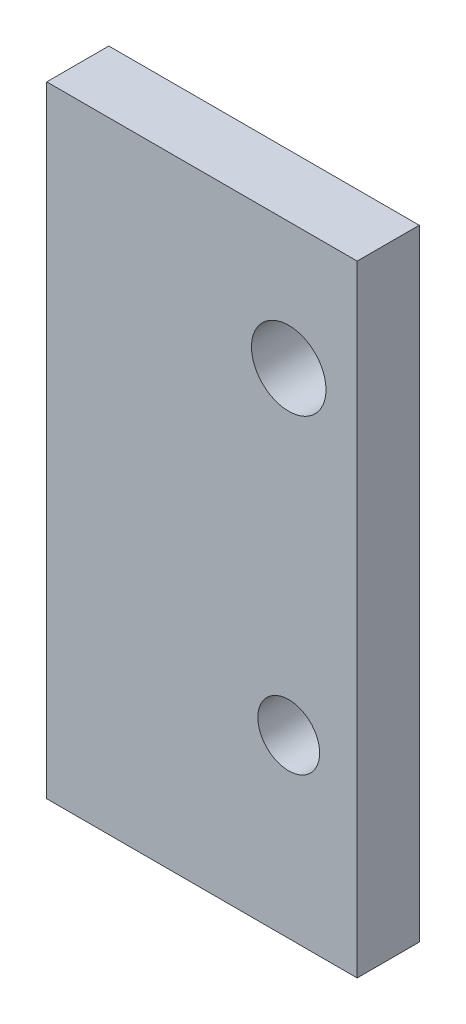
ISO-10303-21;
HEADER;
FILE_DESCRIPTION(('STEP AP214'),'2;1');
FILE_NAME('part.step','',(''),(''),'','','');
FILE_SCHEMA(('AUTOMOTIVE_DESIGN { 1 0 10303 214 1 1 1 1 }'));
ENDSEC;
DATA;
#1=APPLICATION_CONTEXT('core data for automotive mechanical design processes');
#2=APPLICATION_PROTOCOL_DEFINITION('international standard','automotive_design',2000,#1);
#3=PRODUCT_CONTEXT('',#1,'mechanical');
#4=PRODUCT('Part','Part','',(#3));
#5=PRODUCT_RELATED_PRODUCT_CATEGORY('part','',(#4));
#6=PRODUCT_DEFINITION_FORMATION('','',#4);
#7=PRODUCT_DEFINITION_CONTEXT('part definition',#1,'design');
#8=PRODUCT_DEFINITION('design','',#6,#7);
#9=PRODUCT_DEFINITION_SHAPE('','',#8);
#10=(LENGTH_UNIT() NAMED_UNIT(*) SI_UNIT(.MILLI.,.METRE.));
#11=(NAMED_UNIT(*) PLANE_ANGLE_UNIT() SI_UNIT($,.RADIAN.));
#12=(NAMED_UNIT(*) SI_UNIT($,.STERADIAN.) SOLID_ANGLE_UNIT());
#13=UNCERTAINTY_MEASURE_WITH_UNIT(LENGTH_MEASURE(1.E-05),#10,'distance_accuracy_value','');
#14=(GEOMETRIC_REPRESENTATION_CONTEXT(3) GLOBAL_UNCERTAINTY_ASSIGNED_CONTEXT((#13)) GLOBAL_UNIT_ASSIGNED_CONTEXT((#10,
#11,#12)) REPRESENTATION_CONTEXT('',''));
#15=CARTESIAN_POINT('',(0.,0.,0.));
#16=DIRECTION('',(0.,0.,1.));
#17=DIRECTION('',(1.,0.,0.));
#18=AXIS2_PLACEMENT_3D('',#15,#16,#17);
#19=CARTESIAN_POINT('',(6.35,12.7,2.54));
#20=DIRECTION('',(-1.,0.,0.));
#21=DIRECTION('',(0.,-1.,0.));
#22=AXIS2_PLACEMENT_3D('',#19,#20,#21);
#23=PLANE('',#22);
#24=DIRECTION('',(0.,1.,0.));
#25=VECTOR('',#24,1.);
#26=CARTESIAN_POINT('',(6.35,12.7,0.));
#27=LINE('',#26,#25);
#28=CARTESIAN_POINT('',(6.35,-12.7,0.));
#29=VERTEX_POINT('',#28);
#30=CARTESIAN_POINT('',(6.35,12.7,0.));
#31=VERTEX_POINT('',#30);
#32=EDGE_CURVE('E96',#29,#31,#27,.T.);
#33=ORIENTED_EDGE('',*,*,#32,.T.);
#34=DIRECTION('',(0.,0.,-1.));
#35=VECTOR('',#34,1.);
#36=CARTESIAN_POINT('',(6.35,12.7,2.54));
#37=LINE('',#36,#35);
#38=CARTESIAN_POINT('',(6.35,12.7,2.54));
#39=VERTEX_POINT('',#38);
#40=EDGE_CURVE('E11',#39,#31,#37,.T.);
#41=ORIENTED_EDGE('',*,*,#40,.F.);
#42=DIRECTION('',(0.,1.,0.));
#43=VECTOR('',#42,1.);
#44=CARTESIAN_POINT('',(6.35,12.7,2.54));
#45=LINE('',#44,#43);
#46=CARTESIAN_POINT('',(6.35,-12.7,2.54));
#47=VERTEX_POINT('',#46);
#48=EDGE_CURVE('E84',#47,#39,#45,.T.);
#49=ORIENTED_EDGE('',*,*,#48,.F.);
#50=DIRECTION('',(0.,0.,-1.));
#51=VECTOR('',#50,1.);
#52=CARTESIAN_POINT('',(6.35,-12.7,2.54));
#53=LINE('',#52,#51);
#54=EDGE_CURVE('E92',#47,#29,#53,.T.);
#55=ORIENTED_EDGE('',*,*,#54,.T.);
#56=EDGE_LOOP('',(#33,#41,#49,#55));
#57=FACE_BOUND('',#56,.T.);
#58=ADVANCED_FACE('F33',(#57),#23,.F.);
#59=CARTESIAN_POINT('',(-6.35,12.7,2.54));
#60=DIRECTION('',(0.,-1.,0.));
#61=DIRECTION('',(0.,0.,-1.));
#62=AXIS2_PLACEMENT_3D('',#59,#60,#61);
#63=PLANE('',#62);
#64=DIRECTION('',(-1.,0.,0.));
#65=VECTOR('',#64,1.);
#66=CARTESIAN_POINT('',(-6.35,12.7,0.));
#67=LINE('',#66,#65);
#68=CARTESIAN_POINT('',(-6.35,12.7,0.));
#69=VERTEX_POINT('',#68);
#70=EDGE_CURVE('E88',#31,#69,#67,.T.);
#71=ORIENTED_EDGE('',*,*,#70,.T.);
#72=DIRECTION('',(0.,0.,-1.));
#73=VECTOR('',#72,1.);
#74=CARTESIAN_POINT('',(-6.35,12.7,2.54));
#75=LINE('',#74,#73);
#76=CARTESIAN_POINT('',(-6.35,12.7,2.54));
#77=VERTEX_POINT('',#76);
#78=EDGE_CURVE('E41',#77,#69,#75,.T.);
#79=ORIENTED_EDGE('',*,*,#78,.F.);
#80=DIRECTION('',(-1.,0.,0.));
#81=VECTOR('',#80,1.);
#82=CARTESIAN_POINT('',(-6.35,12.7,2.54));
#83=LINE('',#82,#81);
#84=EDGE_CURVE('E79',#39,#77,#83,.T.);
#85=ORIENTED_EDGE('',*,*,#84,.F.);
#86=ORIENTED_EDGE('',*,*,#40,.T.);
#87=EDGE_LOOP('',(#71,#79,#85,#86));
#88=FACE_BOUND('',#87,.T.);
#89=ADVANCED_FACE('F87',(#88),#63,.F.);
#90=CARTESIAN_POINT('',(-6.35,12.7,2.54));
#91=DIRECTION('',(1.,0.,0.));
#92=DIRECTION('',(0.,1.,0.));
#93=AXIS2_PLACEMENT_3D('',#90,#91,#92);
#94=PLANE('',#93);
#95=DIRECTION('',(0.,-1.,0.));
#96=VECTOR('',#95,1.);
#97=CARTESIAN_POINT('',(-6.35,12.7,0.));
#98=LINE('',#97,#96);
#99=CARTESIAN_POINT('',(-6.35,-12.7,0.));
#100=VERTEX_POINT('',#99);
#101=EDGE_CURVE('E66',#69,#100,#98,.T.);
#102=ORIENTED_EDGE('',*,*,#101,.T.);
#103=DIRECTION('',(0.,0.,-1.));
#104=VECTOR('',#103,1.);
#105=CARTESIAN_POINT('',(-6.35,-12.7,2.54));
#106=LINE('',#105,#104);
#107=CARTESIAN_POINT('',(-6.35,-12.7,2.54));
#108=VERTEX_POINT('',#107);
#109=EDGE_CURVE('E89',#108,#100,#106,.T.);
#110=ORIENTED_EDGE('',*,*,#109,.F.);
#111=DIRECTION('',(0.,-1.,0.));
#112=VECTOR('',#111,1.);
#113=CARTESIAN_POINT('',(-6.35,12.7,2.54));
#114=LINE('',#113,#112);
#115=EDGE_CURVE('E82',#77,#108,#114,.T.);
#116=ORIENTED_EDGE('',*,*,#115,.F.);
#117=ORIENTED_EDGE('',*,*,#78,.T.);
#118=EDGE_LOOP('',(#102,#110,#116,#117));
#119=FACE_BOUND('',#118,.T.);
#120=ADVANCED_FACE('F90',(#119),#94,.F.);
#121=CARTESIAN_POINT('',(-6.35,-12.7,2.54));
#122=DIRECTION('',(0.,1.,0.));
#123=DIRECTION('',(0.,0.,1.));
#124=AXIS2_PLACEMENT_3D('',#121,#122,#123);
#125=PLANE('',#124);
#126=DIRECTION('',(1.,0.,0.));
#127=VECTOR('',#126,1.);
#128=CARTESIAN_POINT('',(-6.35,-12.7,0.));
#129=LINE('',#128,#127);
#130=EDGE_CURVE('E72',#100,#29,#129,.T.);
#131=ORIENTED_EDGE('',*,*,#130,.T.);
#132=ORIENTED_EDGE('',*,*,#54,.F.);
#133=DIRECTION('',(1.,0.,0.));
#134=VECTOR('',#133,1.);
#135=CARTESIAN_POINT('',(-6.35,-12.7,2.54));
#136=LINE('',#135,#134);
#137=EDGE_CURVE('E49',#108,#47,#136,.T.);
#138=ORIENTED_EDGE('',*,*,#137,.F.);
#139=ORIENTED_EDGE('',*,*,#109,.T.);
#140=EDGE_LOOP('',(#131,#132,#138,#139));
#141=FACE_BOUND('',#140,.T.);
#142=ADVANCED_FACE('F104',(#141),#125,.F.);
#143=CARTESIAN_POINT('',(0.,0.,2.54));
#144=DIRECTION('',(0.,0.,1.));
#145=DIRECTION('',(1.,0.,0.));
#146=AXIS2_PLACEMENT_3D('',#143,#144,#145);
#147=PLANE('',#146);
#148=CARTESIAN_POINT('',(3.55,-5.49806732728933,2.54));
#149=DIRECTION('',(0.,0.,1.));
#150=DIRECTION('',(1.,0.,0.));
#151=AXIS2_PLACEMENT_3D('',#148,#149,#150);
#152=CIRCLE('',#151,1.26365);
#153=CARTESIAN_POINT('',(4.81365,-5.49806732728933,2.54));
#154=VERTEX_POINT('',#153);
#155=EDGE_CURVE('E118',#154,#154,#152,.T.);
#156=ORIENTED_EDGE('',*,*,#155,.F.);
#157=EDGE_LOOP('',(#156));
#158=FACE_BOUND('',#157,.T.);
#159=CARTESIAN_POINT('',(3.55,7.50193267271067,2.54));
#160=DIRECTION('',(0.,0.,1.));
#161=DIRECTION('',(1.,0.,0.));
#162=AXIS2_PLACEMENT_3D('',#159,#160,#161);
#163=CIRCLE('',#162,1.524);
#164=CARTESIAN_POINT('',(5.074,7.50193267271067,2.54));
#165=VERTEX_POINT('',#164);
#166=EDGE_CURVE('E112',#165,#165,#163,.T.);
#167=ORIENTED_EDGE('',*,*,#166,.F.);
#168=EDGE_LOOP('',(#167));
#169=FACE_BOUND('',#168,.T.);
#170=ORIENTED_EDGE('',*,*,#48,.T.);
#171=ORIENTED_EDGE('',*,*,#84,.T.);
#172=ORIENTED_EDGE('',*,*,#115,.T.);
#173=ORIENTED_EDGE('',*,*,#137,.T.);
#174=EDGE_LOOP('',(#170,#171,#172,#173));
#175=FACE_BOUND('',#174,.T.);
#176=ADVANCED_FACE('F80',(#158,#169,#175),#147,.T.);
#177=CARTESIAN_POINT('',(0.,0.,0.));
#178=DIRECTION('',(0.,0.,1.));
#179=DIRECTION('',(1.,0.,0.));
#180=AXIS2_PLACEMENT_3D('',#177,#178,#179);
#181=PLANE('',#180);
#182=CARTESIAN_POINT('',(3.55,-5.49806732728933,0.));
#183=DIRECTION('',(0.,0.,1.));
#184=DIRECTION('',(1.,0.,0.));
#185=AXIS2_PLACEMENT_3D('',#182,#183,#184);
#186=CIRCLE('',#185,1.26365);
#187=CARTESIAN_POINT('',(4.81365,-5.49806732728933,0.));
#188=VERTEX_POINT('',#187);
#189=EDGE_CURVE('E115',#188,#188,#186,.F.);
#190=ORIENTED_EDGE('',*,*,#189,.F.);
#191=EDGE_LOOP('',(#190));
#192=FACE_BOUND('',#191,.T.);
#193=CARTESIAN_POINT('',(3.55,7.50193267271067,0.));
#194=DIRECTION('',(0.,0.,1.));
#195=DIRECTION('',(1.,0.,0.));
#196=AXIS2_PLACEMENT_3D('',#193,#194,#195);
#197=CIRCLE('',#196,1.524);
#198=CARTESIAN_POINT('',(5.074,7.50193267271067,0.));
#199=VERTEX_POINT('',#198);
#200=EDGE_CURVE('E99',#199,#199,#197,.F.);
#201=ORIENTED_EDGE('',*,*,#200,.F.);
#202=EDGE_LOOP('',(#201));
#203=FACE_BOUND('',#202,.T.);
#204=ORIENTED_EDGE('',*,*,#32,.F.);
#205=ORIENTED_EDGE('',*,*,#130,.F.);
#206=ORIENTED_EDGE('',*,*,#101,.F.);
#207=ORIENTED_EDGE('',*,*,#70,.F.);
#208=EDGE_LOOP('',(#204,#205,#206,#207));
#209=FACE_BOUND('',#208,.T.);
#210=ADVANCED_FACE('F107',(#192,#203,#209),#181,.F.);
#211=CARTESIAN_POINT('',(3.55,7.50193267271067,-0.00100000000000013));
#212=DIRECTION('',(0.,0.,1.));
#213=DIRECTION('',(1.,0.,0.));
#214=AXIS2_PLACEMENT_3D('',#211,#212,#213);
#215=CYLINDRICAL_SURFACE('',#214,1.524);
#216=ORIENTED_EDGE('',*,*,#166,.T.);
#217=EDGE_LOOP('',(#216));
#218=FACE_BOUND('',#217,.T.);
#219=ORIENTED_EDGE('',*,*,#200,.T.);
#220=EDGE_LOOP('',(#219));
#221=FACE_BOUND('',#220,.T.);
#222=ADVANCED_FACE('F130',(#218,#221),#215,.F.);
#223=CARTESIAN_POINT('',(3.55,-5.49806732728933,-0.00100000000000013));
#224=DIRECTION('',(0.,0.,1.));
#225=DIRECTION('',(1.,0.,0.));
#226=AXIS2_PLACEMENT_3D('',#223,#224,#225);
#227=CYLINDRICAL_SURFACE('',#226,1.26365);
#228=ORIENTED_EDGE('',*,*,#155,.T.);
#229=EDGE_LOOP('',(#228));
#230=FACE_BOUND('',#229,.T.);
#231=ORIENTED_EDGE('',*,*,#189,.T.);
#232=EDGE_LOOP('',(#231));
#233=FACE_BOUND('',#232,.T.);
#234=ADVANCED_FACE('F122',(#230,#233),#227,.F.);
#235=CLOSED_SHELL('',(#58,#89,#120,#142,#176,#210,#222,#234));
#236=MANIFOLD_SOLID_BREP('B2',#235);
#237=ADVANCED_BREP_SHAPE_REPRESENTATION('',(#18,#236),#14);
#238=SHAPE_DEFINITION_REPRESENTATION(#9,#237);
ENDSEC;
END-ISO-10303-21;
